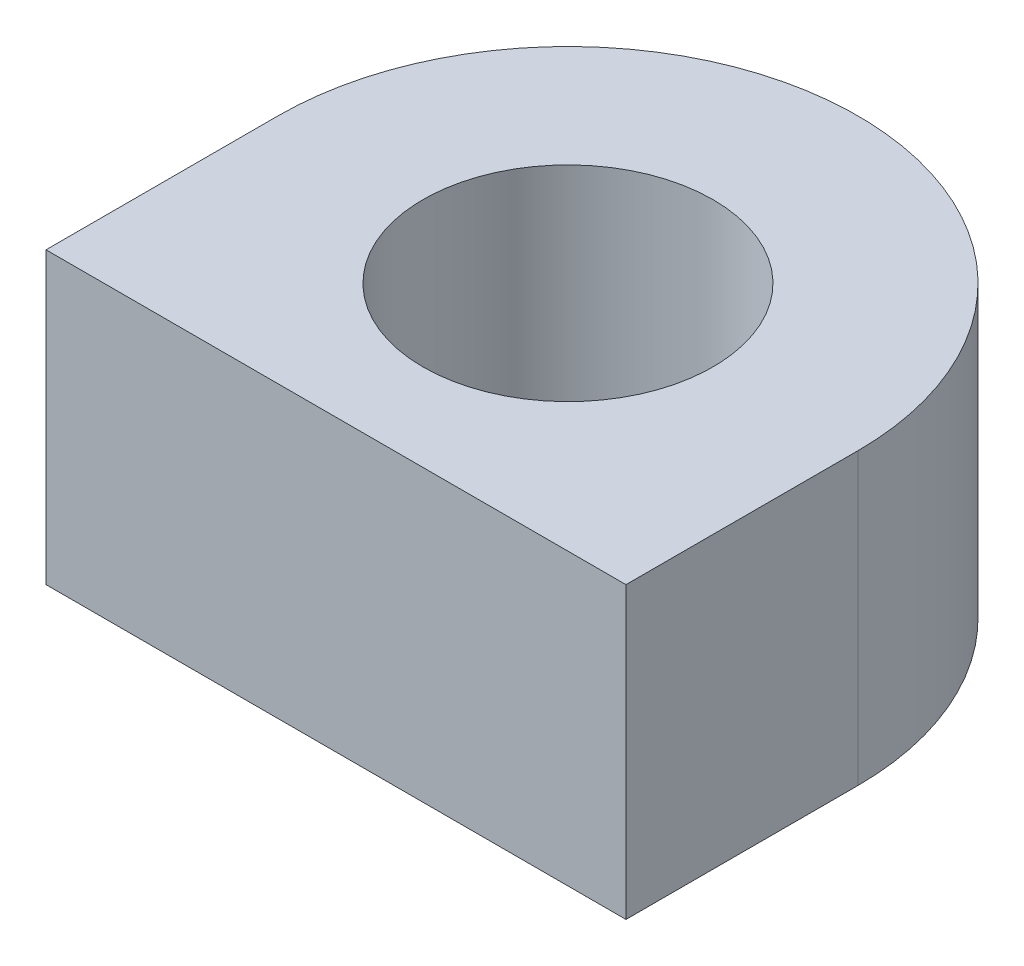
ISO-10303-21;
HEADER;
FILE_DESCRIPTION(('STEP AP214'),'2;1');
FILE_NAME('part.step','',(''),(''),'','','');
FILE_SCHEMA(('AUTOMOTIVE_DESIGN { 1 0 10303 214 1 1 1 1 }'));
ENDSEC;
DATA;
#1=APPLICATION_CONTEXT('core data for automotive mechanical design processes');
#2=APPLICATION_PROTOCOL_DEFINITION('international standard','automotive_design',2000,#1);
#3=PRODUCT_CONTEXT('',#1,'mechanical');
#4=PRODUCT('Part','Part','',(#3));
#5=PRODUCT_RELATED_PRODUCT_CATEGORY('part','',(#4));
#6=PRODUCT_DEFINITION_FORMATION('','',#4);
#7=PRODUCT_DEFINITION_CONTEXT('part definition',#1,'design');
#8=PRODUCT_DEFINITION('design','',#6,#7);
#9=PRODUCT_DEFINITION_SHAPE('','',#8);
#10=(LENGTH_UNIT() NAMED_UNIT(*) SI_UNIT(.MILLI.,.METRE.));
#11=(NAMED_UNIT(*) PLANE_ANGLE_UNIT() SI_UNIT($,.RADIAN.));
#12=(NAMED_UNIT(*) SI_UNIT($,.STERADIAN.) SOLID_ANGLE_UNIT());
#13=UNCERTAINTY_MEASURE_WITH_UNIT(LENGTH_MEASURE(1.E-05),#10,'distance_accuracy_value','');
#14=(GEOMETRIC_REPRESENTATION_CONTEXT(3) GLOBAL_UNCERTAINTY_ASSIGNED_CONTEXT((#13)) GLOBAL_UNIT_ASSIGNED_CONTEXT((#10,
#11,#12)) REPRESENTATION_CONTEXT('',''));
#15=CARTESIAN_POINT('',(0.,0.,0.));
#16=DIRECTION('',(0.,0.,1.));
#17=DIRECTION('',(1.,0.,0.));
#18=AXIS2_PLACEMENT_3D('',#15,#16,#17);
#19=CARTESIAN_POINT('',(0.,10.,0.));
#20=DIRECTION('',(0.,-1.,0.));
#21=DIRECTION('',(0.,0.,-1.));
#22=AXIS2_PLACEMENT_3D('',#19,#20,#21);
#23=PLANE('',#22);
#24=DIRECTION('',(1.,0.,0.));
#25=VECTOR('',#24,1.);
#26=CARTESIAN_POINT('',(10.,10.,7.99999999999999));
#27=LINE('',#26,#25);
#28=CARTESIAN_POINT('',(-10.,10.,8.));
#29=VERTEX_POINT('',#28);
#30=CARTESIAN_POINT('',(10.,10.,7.99999999999999));
#31=VERTEX_POINT('',#30);
#32=EDGE_CURVE('E96',#29,#31,#27,.T.);
#33=ORIENTED_EDGE('',*,*,#32,.T.);
#34=DIRECTION('',(0.,0.,-1.));
#35=VECTOR('',#34,1.);
#36=CARTESIAN_POINT('',(10.,10.,0.));
#37=LINE('',#36,#35);
#38=CARTESIAN_POINT('',(10.,10.,0.));
#39=VERTEX_POINT('',#38);
#40=EDGE_CURVE('E91',#31,#39,#37,.T.);
#41=ORIENTED_EDGE('',*,*,#40,.T.);
#42=CARTESIAN_POINT('',(0.,10.,0.));
#43=DIRECTION('',(0.,1.,0.));
#44=DIRECTION('',(0.,0.,-1.));
#45=AXIS2_PLACEMENT_3D('',#42,#43,#44);
#46=CIRCLE('',#45,10.);
#47=CARTESIAN_POINT('',(-10.,10.,0.));
#48=VERTEX_POINT('',#47);
#49=EDGE_CURVE('E94',#39,#48,#46,.T.);
#50=ORIENTED_EDGE('',*,*,#49,.T.);
#51=DIRECTION('',(0.,0.,1.));
#52=VECTOR('',#51,1.);
#53=CARTESIAN_POINT('',(-10.,10.,8.));
#54=LINE('',#53,#52);
#55=EDGE_CURVE('E61',#48,#29,#54,.T.);
#56=ORIENTED_EDGE('',*,*,#55,.T.);
#57=EDGE_LOOP('',(#33,#41,#50,#56));
#58=FACE_BOUND('',#57,.T.);
#59=CARTESIAN_POINT('',(0.,10.,0.));
#60=DIRECTION('',(0.,1.,0.));
#61=DIRECTION('',(0.,0.,1.));
#62=AXIS2_PLACEMENT_3D('',#59,#60,#61);
#63=CIRCLE('',#62,5.);
#64=CARTESIAN_POINT('',(0.,10.,5.));
#65=VERTEX_POINT('',#64);
#66=EDGE_CURVE('E116',#65,#65,#63,.T.);
#67=ORIENTED_EDGE('',*,*,#66,.F.);
#68=EDGE_LOOP('',(#67));
#69=FACE_BOUND('',#68,.T.);
#70=ADVANCED_FACE('F43',(#58,#69),#23,.F.);
#71=CARTESIAN_POINT('',(0.,0.,0.));
#72=DIRECTION('',(0.,-1.,0.));
#73=DIRECTION('',(0.,0.,-1.));
#74=AXIS2_PLACEMENT_3D('',#71,#72,#73);
#75=PLANE('',#74);
#76=DIRECTION('',(1.,0.,0.));
#77=VECTOR('',#76,1.);
#78=CARTESIAN_POINT('',(10.,0.,7.99999999999999));
#79=LINE('',#78,#77);
#80=CARTESIAN_POINT('',(-10.,0.,8.));
#81=VERTEX_POINT('',#80);
#82=CARTESIAN_POINT('',(10.,0.,7.99999999999999));
#83=VERTEX_POINT('',#82);
#84=EDGE_CURVE('E112',#81,#83,#79,.T.);
#85=ORIENTED_EDGE('',*,*,#84,.F.);
#86=DIRECTION('',(0.,0.,1.));
#87=VECTOR('',#86,1.);
#88=CARTESIAN_POINT('',(-10.,0.,8.));
#89=LINE('',#88,#87);
#90=CARTESIAN_POINT('',(-10.,0.,0.));
#91=VERTEX_POINT('',#90);
#92=EDGE_CURVE('E84',#91,#81,#89,.T.);
#93=ORIENTED_EDGE('',*,*,#92,.F.);
#94=CARTESIAN_POINT('',(0.,0.,0.));
#95=DIRECTION('',(0.,1.,0.));
#96=DIRECTION('',(0.,0.,-1.));
#97=AXIS2_PLACEMENT_3D('',#94,#95,#96);
#98=CIRCLE('',#97,10.);
#99=CARTESIAN_POINT('',(10.,0.,0.));
#100=VERTEX_POINT('',#99);
#101=EDGE_CURVE('E78',#100,#91,#98,.T.);
#102=ORIENTED_EDGE('',*,*,#101,.F.);
#103=DIRECTION('',(0.,0.,-1.));
#104=VECTOR('',#103,1.);
#105=CARTESIAN_POINT('',(10.,0.,0.));
#106=LINE('',#105,#104);
#107=EDGE_CURVE('E101',#83,#100,#106,.T.);
#108=ORIENTED_EDGE('',*,*,#107,.F.);
#109=EDGE_LOOP('',(#85,#93,#102,#108));
#110=FACE_BOUND('',#109,.T.);
#111=CARTESIAN_POINT('',(0.,0.,0.));
#112=DIRECTION('',(0.,1.,0.));
#113=DIRECTION('',(0.,0.,1.));
#114=AXIS2_PLACEMENT_3D('',#111,#112,#113);
#115=CIRCLE('',#114,5.);
#116=CARTESIAN_POINT('',(0.,0.,5.));
#117=VERTEX_POINT('',#116);
#118=EDGE_CURVE('E134',#117,#117,#115,.T.);
#119=ORIENTED_EDGE('',*,*,#118,.T.);
#120=EDGE_LOOP('',(#119));
#121=FACE_BOUND('',#120,.T.);
#122=ADVANCED_FACE('F129',(#110,#121),#75,.T.);
#123=CARTESIAN_POINT('',(10.,10.,7.99999999999999));
#124=DIRECTION('',(0.,0.,-1.));
#125=DIRECTION('',(-1.,0.,0.));
#126=AXIS2_PLACEMENT_3D('',#123,#124,#125);
#127=PLANE('',#126);
#128=ORIENTED_EDGE('',*,*,#84,.T.);
#129=DIRECTION('',(0.,-1.,0.));
#130=VECTOR('',#129,1.);
#131=CARTESIAN_POINT('',(10.,10.,7.99999999999999));
#132=LINE('',#131,#130);
#133=EDGE_CURVE('E11',#31,#83,#132,.T.);
#134=ORIENTED_EDGE('',*,*,#133,.F.);
#135=ORIENTED_EDGE('',*,*,#32,.F.);
#136=DIRECTION('',(0.,-1.,0.));
#137=VECTOR('',#136,1.);
#138=CARTESIAN_POINT('',(-10.,10.,8.));
#139=LINE('',#138,#137);
#140=EDGE_CURVE('E108',#29,#81,#139,.T.);
#141=ORIENTED_EDGE('',*,*,#140,.T.);
#142=EDGE_LOOP('',(#128,#134,#135,#141));
#143=FACE_BOUND('',#142,.T.);
#144=ADVANCED_FACE('F45',(#143),#127,.F.);
#145=CARTESIAN_POINT('',(10.,10.,0.));
#146=DIRECTION('',(-1.,0.,0.));
#147=DIRECTION('',(0.,0.,1.));
#148=AXIS2_PLACEMENT_3D('',#145,#146,#147);
#149=PLANE('',#148);
#150=ORIENTED_EDGE('',*,*,#107,.T.);
#151=DIRECTION('',(0.,-1.,0.));
#152=VECTOR('',#151,1.);
#153=CARTESIAN_POINT('',(10.,10.,0.));
#154=LINE('',#153,#152);
#155=EDGE_CURVE('E53',#39,#100,#154,.T.);
#156=ORIENTED_EDGE('',*,*,#155,.F.);
#157=ORIENTED_EDGE('',*,*,#40,.F.);
#158=ORIENTED_EDGE('',*,*,#133,.T.);
#159=EDGE_LOOP('',(#150,#156,#157,#158));
#160=FACE_BOUND('',#159,.T.);
#161=ADVANCED_FACE('F100',(#160),#149,.F.);
#162=CARTESIAN_POINT('',(0.,10.,0.));
#163=DIRECTION('',(0.,-1.,0.));
#164=DIRECTION('',(0.,0.,-1.));
#165=AXIS2_PLACEMENT_3D('',#162,#163,#164);
#166=CYLINDRICAL_SURFACE('',#165,10.);
#167=ORIENTED_EDGE('',*,*,#101,.T.);
#168=DIRECTION('',(0.,-1.,0.));
#169=VECTOR('',#168,1.);
#170=CARTESIAN_POINT('',(-10.,10.,0.));
#171=LINE('',#170,#169);
#172=EDGE_CURVE('E103',#48,#91,#171,.T.);
#173=ORIENTED_EDGE('',*,*,#172,.F.);
#174=ORIENTED_EDGE('',*,*,#49,.F.);
#175=ORIENTED_EDGE('',*,*,#155,.T.);
#176=EDGE_LOOP('',(#167,#173,#174,#175));
#177=FACE_BOUND('',#176,.T.);
#178=ADVANCED_FACE('F104',(#177),#166,.T.);
#179=CARTESIAN_POINT('',(-10.,10.,8.));
#180=DIRECTION('',(1.,0.,0.));
#181=DIRECTION('',(0.,0.,-1.));
#182=AXIS2_PLACEMENT_3D('',#179,#180,#181);
#183=PLANE('',#182);
#184=ORIENTED_EDGE('',*,*,#92,.T.);
#185=ORIENTED_EDGE('',*,*,#140,.F.);
#186=ORIENTED_EDGE('',*,*,#55,.F.);
#187=ORIENTED_EDGE('',*,*,#172,.T.);
#188=EDGE_LOOP('',(#184,#185,#186,#187));
#189=FACE_BOUND('',#188,.T.);
#190=ADVANCED_FACE('F126',(#189),#183,.F.);
#191=CARTESIAN_POINT('',(0.,10.,0.));
#192=DIRECTION('',(0.,-1.,0.));
#193=DIRECTION('',(0.,0.,-1.));
#194=AXIS2_PLACEMENT_3D('',#191,#192,#193);
#195=CYLINDRICAL_SURFACE('',#194,5.);
#196=ORIENTED_EDGE('',*,*,#66,.T.);
#197=EDGE_LOOP('',(#196));
#198=FACE_BOUND('',#197,.T.);
#199=ORIENTED_EDGE('',*,*,#118,.F.);
#200=EDGE_LOOP('',(#199));
#201=FACE_BOUND('',#200,.T.);
#202=ADVANCED_FACE('F142',(#198,#201),#195,.F.);
#203=CLOSED_SHELL('',(#70,#122,#144,#161,#178,#190,#202));
#204=MANIFOLD_SOLID_BREP('B2',#203);
#205=ADVANCED_BREP_SHAPE_REPRESENTATION('',(#18,#204),#14);
#206=SHAPE_DEFINITION_REPRESENTATION(#9,#205);
ENDSEC;
END-ISO-10303-21;
